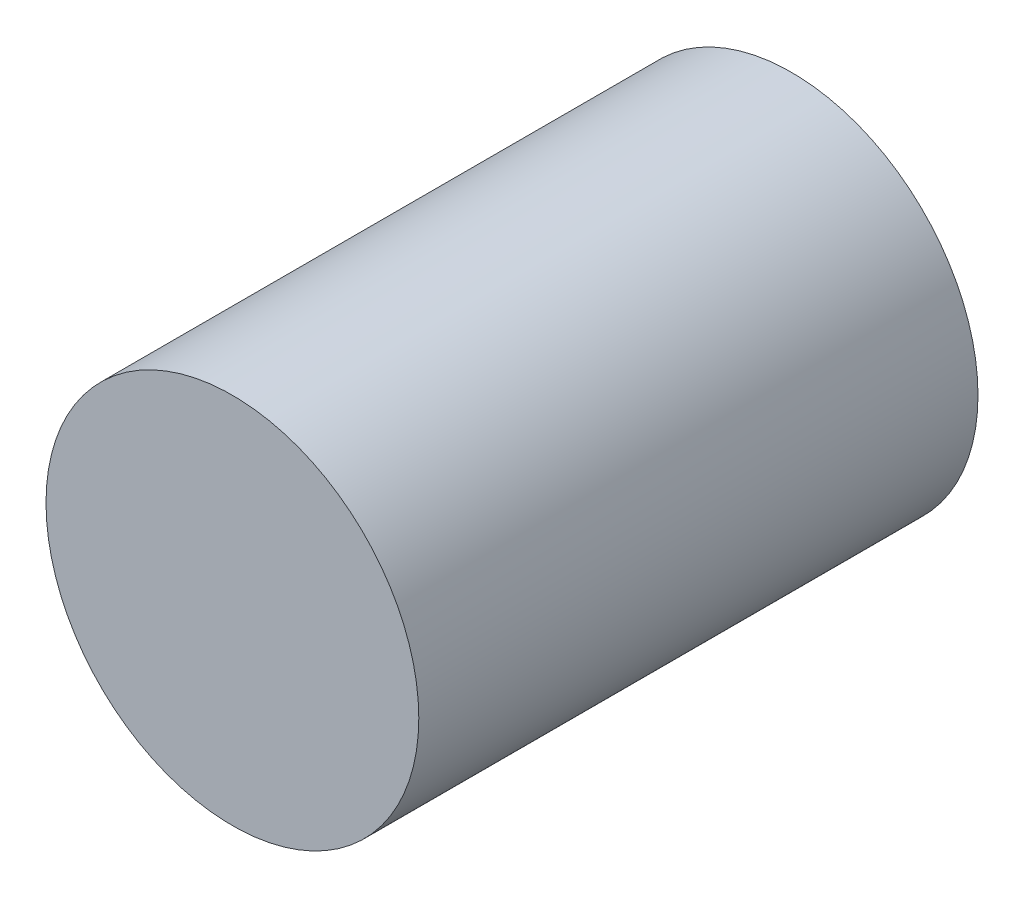
ISO-10303-21;
HEADER;
FILE_DESCRIPTION(('STEP AP214'),'2;1');
FILE_NAME('part.step','',(''),(''),'','','');
FILE_SCHEMA(('AUTOMOTIVE_DESIGN { 1 0 10303 214 1 1 1 1 }'));
ENDSEC;
DATA;
#1=APPLICATION_CONTEXT('core data for automotive mechanical design processes');
#2=APPLICATION_PROTOCOL_DEFINITION('international standard','automotive_design',2000,#1);
#3=PRODUCT_CONTEXT('',#1,'mechanical');
#4=PRODUCT('Part','Part','',(#3));
#5=PRODUCT_RELATED_PRODUCT_CATEGORY('part','',(#4));
#6=PRODUCT_DEFINITION_FORMATION('','',#4);
#7=PRODUCT_DEFINITION_CONTEXT('part definition',#1,'design');
#8=PRODUCT_DEFINITION('design','',#6,#7);
#9=PRODUCT_DEFINITION_SHAPE('','',#8);
#10=(LENGTH_UNIT() NAMED_UNIT(*) SI_UNIT(.MILLI.,.METRE.));
#11=(NAMED_UNIT(*) PLANE_ANGLE_UNIT() SI_UNIT($,.RADIAN.));
#12=(NAMED_UNIT(*) SI_UNIT($,.STERADIAN.) SOLID_ANGLE_UNIT());
#13=UNCERTAINTY_MEASURE_WITH_UNIT(LENGTH_MEASURE(1.E-05),#10,'distance_accuracy_value','');
#14=(GEOMETRIC_REPRESENTATION_CONTEXT(3) GLOBAL_UNCERTAINTY_ASSIGNED_CONTEXT((#13)) GLOBAL_UNIT_ASSIGNED_CONTEXT((#10,
#11,#12)) REPRESENTATION_CONTEXT('',''));
#15=CARTESIAN_POINT('',(0.,0.,0.));
#16=DIRECTION('',(0.,0.,1.));
#17=DIRECTION('',(1.,0.,0.));
#18=AXIS2_PLACEMENT_3D('',#15,#16,#17);
#19=CARTESIAN_POINT('',(0.,0.,30.));
#20=DIRECTION('',(0.,0.,-1.));
#21=DIRECTION('',(-1.,0.,0.));
#22=AXIS2_PLACEMENT_3D('',#19,#20,#21);
#23=CYLINDRICAL_SURFACE('',#22,20.);
#24=CARTESIAN_POINT('',(0.,0.,30.));
#25=DIRECTION('',(0.,0.,1.));
#26=DIRECTION('',(1.,0.,0.));
#27=AXIS2_PLACEMENT_3D('',#24,#25,#26);
#28=CIRCLE('',#27,20.);
#29=CARTESIAN_POINT('',(20.,0.,30.));
#30=VERTEX_POINT('',#29);
#31=EDGE_CURVE('E12',#30,#30,#28,.T.);
#32=ORIENTED_EDGE('',*,*,#31,.F.);
#33=EDGE_LOOP('',(#32));
#34=FACE_BOUND('',#33,.T.);
#35=CARTESIAN_POINT('',(0.,0.,-30.));
#36=DIRECTION('',(0.,0.,1.));
#37=DIRECTION('',(1.,0.,0.));
#38=AXIS2_PLACEMENT_3D('',#35,#36,#37);
#39=CIRCLE('',#38,20.);
#40=CARTESIAN_POINT('',(20.,0.,-30.));
#41=VERTEX_POINT('',#40);
#42=EDGE_CURVE('E44',#41,#41,#39,.T.);
#43=ORIENTED_EDGE('',*,*,#42,.T.);
#44=EDGE_LOOP('',(#43));
#45=FACE_BOUND('',#44,.T.);
#46=ADVANCED_FACE('F41',(#34,#45),#23,.T.);
#47=CARTESIAN_POINT('',(0.,0.,30.));
#48=DIRECTION('',(0.,0.,1.));
#49=DIRECTION('',(1.,0.,0.));
#50=AXIS2_PLACEMENT_3D('',#47,#48,#49);
#51=PLANE('',#50);
#52=ORIENTED_EDGE('',*,*,#31,.T.);
#53=EDGE_LOOP('',(#52));
#54=FACE_BOUND('',#53,.T.);
#55=ADVANCED_FACE('F56',(#54),#51,.T.);
#56=CARTESIAN_POINT('',(0.,0.,-30.));
#57=DIRECTION('',(0.,0.,1.));
#58=DIRECTION('',(1.,0.,0.));
#59=AXIS2_PLACEMENT_3D('',#56,#57,#58);
#60=PLANE('',#59);
#61=ORIENTED_EDGE('',*,*,#42,.F.);
#62=EDGE_LOOP('',(#61));
#63=FACE_BOUND('',#62,.T.);
#64=ADVANCED_FACE('F54',(#63),#60,.F.);
#65=CLOSED_SHELL('',(#46,#55,#64));
#66=MANIFOLD_SOLID_BREP('B2',#65);
#67=ADVANCED_BREP_SHAPE_REPRESENTATION('',(#18,#66),#14);
#68=SHAPE_DEFINITION_REPRESENTATION(#9,#67);
ENDSEC;
END-ISO-10303-21;
